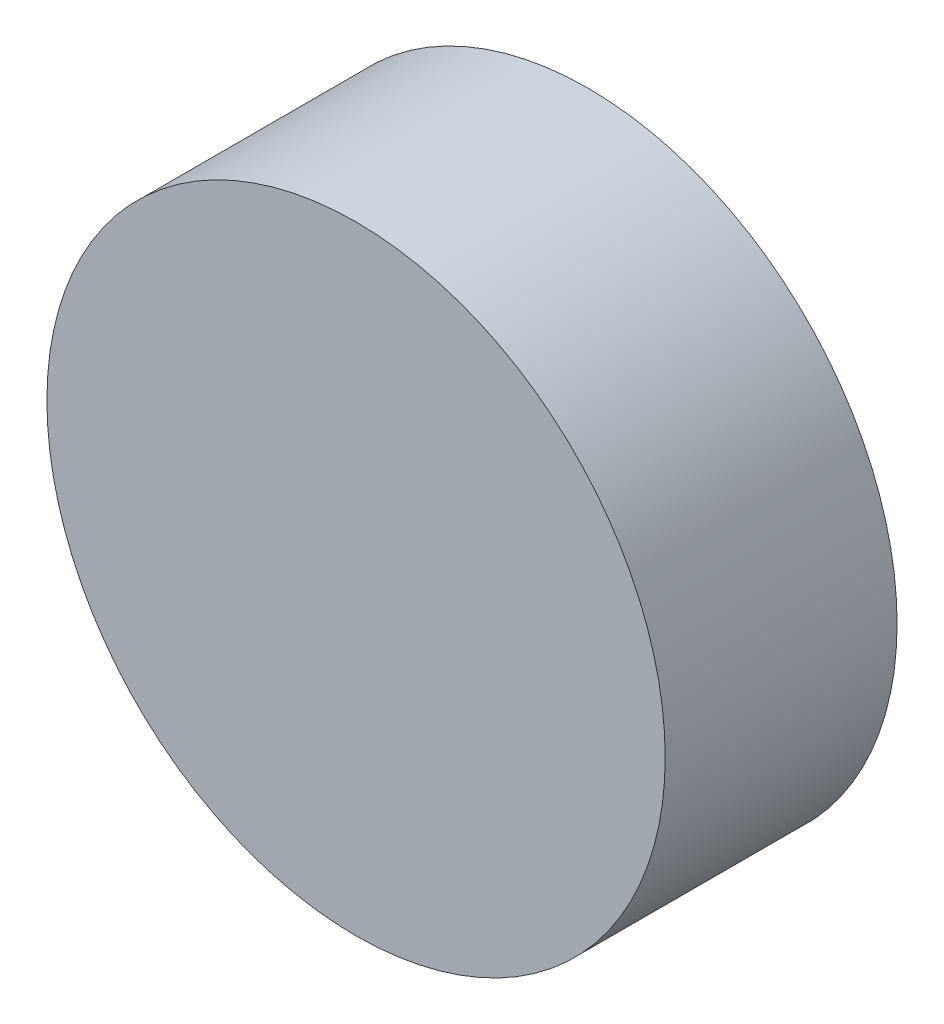
ISO-10303-21;
HEADER;
FILE_DESCRIPTION(('STEP AP214'),'2;1');
FILE_NAME('part.step','',(''),(''),'','','');
FILE_SCHEMA(('AUTOMOTIVE_DESIGN { 1 0 10303 214 1 1 1 1 }'));
ENDSEC;
DATA;
#1=APPLICATION_CONTEXT('core data for automotive mechanical design processes');
#2=APPLICATION_PROTOCOL_DEFINITION('international standard','automotive_design',2000,#1);
#3=PRODUCT_CONTEXT('',#1,'mechanical');
#4=PRODUCT('Part','Part','',(#3));
#5=PRODUCT_RELATED_PRODUCT_CATEGORY('part','',(#4));
#6=PRODUCT_DEFINITION_FORMATION('','',#4);
#7=PRODUCT_DEFINITION_CONTEXT('part definition',#1,'design');
#8=PRODUCT_DEFINITION('design','',#6,#7);
#9=PRODUCT_DEFINITION_SHAPE('','',#8);
#10=(LENGTH_UNIT() NAMED_UNIT(*) SI_UNIT(.MILLI.,.METRE.));
#11=(NAMED_UNIT(*) PLANE_ANGLE_UNIT() SI_UNIT($,.RADIAN.));
#12=(NAMED_UNIT(*) SI_UNIT($,.STERADIAN.) SOLID_ANGLE_UNIT());
#13=UNCERTAINTY_MEASURE_WITH_UNIT(LENGTH_MEASURE(1.E-05),#10,'distance_accuracy_value','');
#14=(GEOMETRIC_REPRESENTATION_CONTEXT(3) GLOBAL_UNCERTAINTY_ASSIGNED_CONTEXT((#13)) GLOBAL_UNIT_ASSIGNED_CONTEXT((#10,
#11,#12)) REPRESENTATION_CONTEXT('',''));
#15=CARTESIAN_POINT('',(0.,0.,0.));
#16=DIRECTION('',(0.,0.,1.));
#17=DIRECTION('',(1.,0.,0.));
#18=AXIS2_PLACEMENT_3D('',#15,#16,#17);
#19=CARTESIAN_POINT('',(15.,15.,1.));
#20=DIRECTION('',(0.,0.,-1.));
#21=DIRECTION('',(-1.,0.,0.));
#22=AXIS2_PLACEMENT_3D('',#19,#20,#21);
#23=CYLINDRICAL_SURFACE('',#22,5.);
#24=CARTESIAN_POINT('',(15.,15.,1.));
#25=DIRECTION('',(0.,0.,1.));
#26=DIRECTION('',(1.,0.,0.));
#27=AXIS2_PLACEMENT_3D('',#24,#25,#26);
#28=CIRCLE('',#27,5.);
#29=CARTESIAN_POINT('',(20.,15.,1.));
#30=VERTEX_POINT('',#29);
#31=EDGE_CURVE('E10',#30,#30,#28,.T.);
#32=ORIENTED_EDGE('',*,*,#31,.F.);
#33=EDGE_LOOP('',(#32));
#34=FACE_BOUND('',#33,.T.);
#35=CARTESIAN_POINT('',(15.,15.,0.));
#36=DIRECTION('',(0.,0.,1.));
#37=DIRECTION('',(1.,0.,0.));
#38=AXIS2_PLACEMENT_3D('',#35,#36,#37);
#39=CIRCLE('',#38,5.);
#40=CARTESIAN_POINT('',(20.,15.,0.));
#41=VERTEX_POINT('',#40);
#42=EDGE_CURVE('E33',#41,#41,#39,.T.);
#43=ORIENTED_EDGE('',*,*,#42,.T.);
#44=EDGE_LOOP('',(#43));
#45=FACE_BOUND('',#44,.T.);
#46=ADVANCED_FACE('F30',(#34,#45),#23,.T.);
#47=CARTESIAN_POINT('',(15.,15.,0.));
#48=DIRECTION('',(0.,0.,1.));
#49=DIRECTION('',(1.,0.,0.));
#50=AXIS2_PLACEMENT_3D('',#47,#48,#49);
#51=PLANE('',#50);
#52=ORIENTED_EDGE('',*,*,#42,.F.);
#53=EDGE_LOOP('',(#52));
#54=FACE_BOUND('',#53,.T.);
#55=ADVANCED_FACE('F53',(#54),#51,.F.);
#56=CARTESIAN_POINT('',(15.,15.,7.));
#57=DIRECTION('',(0.,0.,-1.));
#58=DIRECTION('',(-1.,0.,0.));
#59=AXIS2_PLACEMENT_3D('',#56,#57,#58);
#60=CYLINDRICAL_SURFACE('',#59,8.);
#61=CARTESIAN_POINT('',(15.,15.,7.));
#62=DIRECTION('',(0.,0.,1.));
#63=DIRECTION('',(1.,0.,0.));
#64=AXIS2_PLACEMENT_3D('',#61,#62,#63);
#65=CIRCLE('',#64,8.);
#66=CARTESIAN_POINT('',(23.,15.,7.));
#67=VERTEX_POINT('',#66);
#68=EDGE_CURVE('E40',#67,#67,#65,.T.);
#69=ORIENTED_EDGE('',*,*,#68,.F.);
#70=EDGE_LOOP('',(#69));
#71=FACE_BOUND('',#70,.T.);
#72=CARTESIAN_POINT('',(15.,15.,1.));
#73=DIRECTION('',(0.,0.,1.));
#74=DIRECTION('',(1.,0.,0.));
#75=AXIS2_PLACEMENT_3D('',#72,#73,#74);
#76=CIRCLE('',#75,8.);
#77=CARTESIAN_POINT('',(23.,15.,1.));
#78=VERTEX_POINT('',#77);
#79=EDGE_CURVE('E42',#78,#78,#76,.T.);
#80=ORIENTED_EDGE('',*,*,#79,.T.);
#81=EDGE_LOOP('',(#80));
#82=FACE_BOUND('',#81,.T.);
#83=ADVANCED_FACE('F50',(#71,#82),#60,.T.);
#84=CARTESIAN_POINT('',(15.,15.,7.));
#85=DIRECTION('',(0.,0.,1.));
#86=DIRECTION('',(1.,0.,0.));
#87=AXIS2_PLACEMENT_3D('',#84,#85,#86);
#88=PLANE('',#87);
#89=ORIENTED_EDGE('',*,*,#68,.T.);
#90=EDGE_LOOP('',(#89));
#91=FACE_BOUND('',#90,.T.);
#92=ADVANCED_FACE('F48',(#91),#88,.T.);
#93=CARTESIAN_POINT('',(15.,15.,1.));
#94=DIRECTION('',(0.,0.,1.));
#95=DIRECTION('',(1.,0.,0.));
#96=AXIS2_PLACEMENT_3D('',#93,#94,#95);
#97=PLANE('',#96);
#98=ORIENTED_EDGE('',*,*,#31,.T.);
#99=EDGE_LOOP('',(#98));
#100=FACE_BOUND('',#99,.T.);
#101=ORIENTED_EDGE('',*,*,#79,.F.);
#102=EDGE_LOOP('',(#101));
#103=FACE_BOUND('',#102,.T.);
#104=ADVANCED_FACE('F57',(#100,#103),#97,.F.);
#105=CLOSED_SHELL('',(#46,#55,#83,#92,#104));
#106=MANIFOLD_SOLID_BREP('B2',#105);
#107=ADVANCED_BREP_SHAPE_REPRESENTATION('',(#18,#106),#14);
#108=SHAPE_DEFINITION_REPRESENTATION(#9,#107);
ENDSEC;
END-ISO-10303-21;
